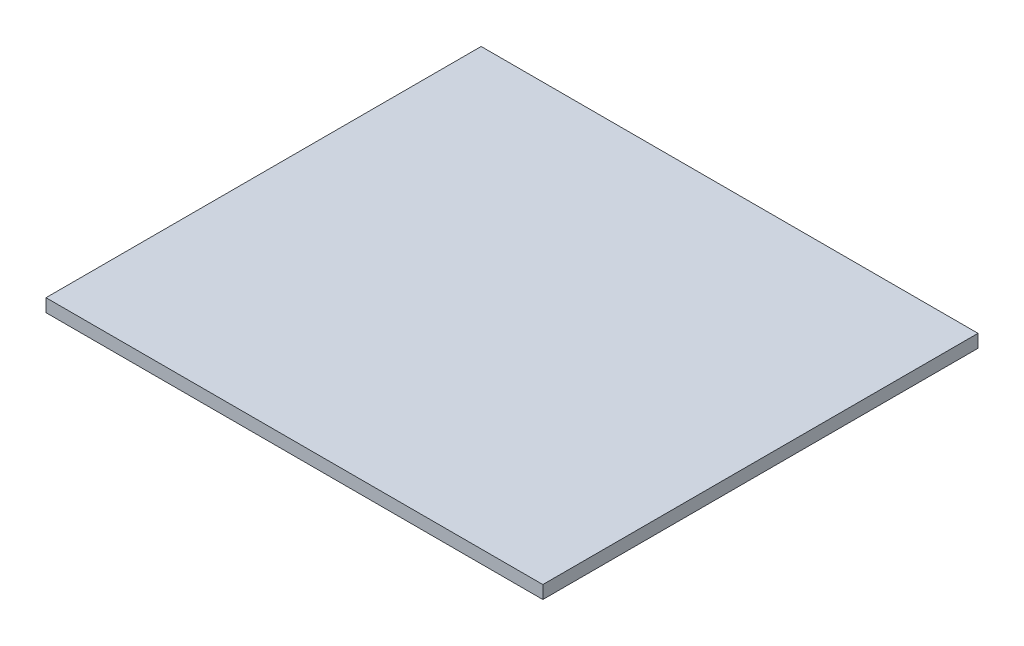
ISO-10303-21;
HEADER;
FILE_DESCRIPTION(('STEP AP214'),'2;1');
FILE_NAME('part.step','',(''),(''),'','','');
FILE_SCHEMA(('AUTOMOTIVE_DESIGN { 1 0 10303 214 1 1 1 1 }'));
ENDSEC;
DATA;
#1=APPLICATION_CONTEXT('core data for automotive mechanical design processes');
#2=APPLICATION_PROTOCOL_DEFINITION('international standard','automotive_design',2000,#1);
#3=PRODUCT_CONTEXT('',#1,'mechanical');
#4=PRODUCT('Part','Part','',(#3));
#5=PRODUCT_RELATED_PRODUCT_CATEGORY('part','',(#4));
#6=PRODUCT_DEFINITION_FORMATION('','',#4);
#7=PRODUCT_DEFINITION_CONTEXT('part definition',#1,'design');
#8=PRODUCT_DEFINITION('design','',#6,#7);
#9=PRODUCT_DEFINITION_SHAPE('','',#8);
#10=(LENGTH_UNIT() NAMED_UNIT(*) SI_UNIT(.MILLI.,.METRE.));
#11=(NAMED_UNIT(*) PLANE_ANGLE_UNIT() SI_UNIT($,.RADIAN.));
#12=(NAMED_UNIT(*) SI_UNIT($,.STERADIAN.) SOLID_ANGLE_UNIT());
#13=UNCERTAINTY_MEASURE_WITH_UNIT(LENGTH_MEASURE(1.E-05),#10,'distance_accuracy_value','');
#14=(GEOMETRIC_REPRESENTATION_CONTEXT(3) GLOBAL_UNCERTAINTY_ASSIGNED_CONTEXT((#13)) GLOBAL_UNIT_ASSIGNED_CONTEXT((#10,
#11,#12)) REPRESENTATION_CONTEXT('',''));
#15=CARTESIAN_POINT('',(0.,0.,0.));
#16=DIRECTION('',(0.,0.,1.));
#17=DIRECTION('',(1.,0.,0.));
#18=AXIS2_PLACEMENT_3D('',#15,#16,#17);
#19=CARTESIAN_POINT('',(0.,2.9972,96.38));
#20=DIRECTION('',(1.,0.,0.));
#21=DIRECTION('',(0.,0.,-1.));
#22=AXIS2_PLACEMENT_3D('',#19,#20,#21);
#23=PLANE('',#22);
#24=DIRECTION('',(0.,0.,1.));
#25=VECTOR('',#24,1.);
#26=CARTESIAN_POINT('',(0.,0.,96.38));
#27=LINE('',#26,#25);
#28=CARTESIAN_POINT('',(0.,0.,-3.95));
#29=VERTEX_POINT('',#28);
#30=CARTESIAN_POINT('',(0.,0.,96.38));
#31=VERTEX_POINT('',#30);
#32=EDGE_CURVE('E113',#29,#31,#27,.T.);
#33=ORIENTED_EDGE('',*,*,#32,.T.);
#34=DIRECTION('',(0.,-1.,0.));
#35=VECTOR('',#34,1.);
#36=CARTESIAN_POINT('',(0.,2.9972,96.38));
#37=LINE('',#36,#35);
#38=CARTESIAN_POINT('',(0.,2.9972,96.38));
#39=VERTEX_POINT('',#38);
#40=EDGE_CURVE('E11',#39,#31,#37,.T.);
#41=ORIENTED_EDGE('',*,*,#40,.F.);
#42=DIRECTION('',(0.,0.,1.));
#43=VECTOR('',#42,1.);
#44=CARTESIAN_POINT('',(0.,2.9972,96.38));
#45=LINE('',#44,#43);
#46=CARTESIAN_POINT('',(0.,2.9972,-3.95));
#47=VERTEX_POINT('',#46);
#48=EDGE_CURVE('E97',#47,#39,#45,.T.);
#49=ORIENTED_EDGE('',*,*,#48,.F.);
#50=DIRECTION('',(0.,-1.,0.));
#51=VECTOR('',#50,1.);
#52=CARTESIAN_POINT('',(0.,2.9972,-3.95));
#53=LINE('',#52,#51);
#54=EDGE_CURVE('E109',#47,#29,#53,.T.);
#55=ORIENTED_EDGE('',*,*,#54,.T.);
#56=EDGE_LOOP('',(#33,#41,#49,#55));
#57=FACE_BOUND('',#56,.T.);
#58=ADVANCED_FACE('F45',(#57),#23,.F.);
#59=CARTESIAN_POINT('',(0.,2.9972,96.38));
#60=DIRECTION('',(0.,0.,-1.));
#61=DIRECTION('',(-1.,0.,0.));
#62=AXIS2_PLACEMENT_3D('',#59,#60,#61);
#63=PLANE('',#62);
#64=DIRECTION('',(1.,0.,0.));
#65=VECTOR('',#64,1.);
#66=CARTESIAN_POINT('',(0.,0.,96.38));
#67=LINE('',#66,#65);
#68=CARTESIAN_POINT('',(114.554,0.,96.38));
#69=VERTEX_POINT('',#68);
#70=EDGE_CURVE('E102',#31,#69,#67,.T.);
#71=ORIENTED_EDGE('',*,*,#70,.T.);
#72=DIRECTION('',(0.,-1.,0.));
#73=VECTOR('',#72,1.);
#74=CARTESIAN_POINT('',(114.554,2.9972,96.38));
#75=LINE('',#74,#73);
#76=CARTESIAN_POINT('',(114.554,2.9972,96.38));
#77=VERTEX_POINT('',#76);
#78=EDGE_CURVE('E54',#77,#69,#75,.T.);
#79=ORIENTED_EDGE('',*,*,#78,.F.);
#80=DIRECTION('',(1.,0.,0.));
#81=VECTOR('',#80,1.);
#82=CARTESIAN_POINT('',(0.,2.9972,96.38));
#83=LINE('',#82,#81);
#84=EDGE_CURVE('E92',#39,#77,#83,.T.);
#85=ORIENTED_EDGE('',*,*,#84,.F.);
#86=ORIENTED_EDGE('',*,*,#40,.T.);
#87=EDGE_LOOP('',(#71,#79,#85,#86));
#88=FACE_BOUND('',#87,.T.);
#89=ADVANCED_FACE('F101',(#88),#63,.F.);
#90=CARTESIAN_POINT('',(114.554,2.9972,96.38));
#91=DIRECTION('',(-1.,0.,0.));
#92=DIRECTION('',(0.,0.,1.));
#93=AXIS2_PLACEMENT_3D('',#90,#91,#92);
#94=PLANE('',#93);
#95=DIRECTION('',(0.,0.,-1.));
#96=VECTOR('',#95,1.);
#97=CARTESIAN_POINT('',(114.554,0.,96.38));
#98=LINE('',#97,#96);
#99=CARTESIAN_POINT('',(114.554,0.,-3.95));
#100=VERTEX_POINT('',#99);
#101=EDGE_CURVE('E79',#69,#100,#98,.T.);
#102=ORIENTED_EDGE('',*,*,#101,.T.);
#103=DIRECTION('',(0.,-1.,0.));
#104=VECTOR('',#103,1.);
#105=CARTESIAN_POINT('',(114.554,2.9972,-3.95));
#106=LINE('',#105,#104);
#107=CARTESIAN_POINT('',(114.554,2.9972,-3.95));
#108=VERTEX_POINT('',#107);
#109=EDGE_CURVE('E104',#108,#100,#106,.T.);
#110=ORIENTED_EDGE('',*,*,#109,.F.);
#111=DIRECTION('',(0.,0.,-1.));
#112=VECTOR('',#111,1.);
#113=CARTESIAN_POINT('',(114.554,2.9972,96.38));
#114=LINE('',#113,#112);
#115=EDGE_CURVE('E95',#77,#108,#114,.T.);
#116=ORIENTED_EDGE('',*,*,#115,.F.);
#117=ORIENTED_EDGE('',*,*,#78,.T.);
#118=EDGE_LOOP('',(#102,#110,#116,#117));
#119=FACE_BOUND('',#118,.T.);
#120=ADVANCED_FACE('F105',(#119),#94,.F.);
#121=CARTESIAN_POINT('',(0.,2.9972,-3.95));
#122=DIRECTION('',(0.,0.,1.));
#123=DIRECTION('',(1.,0.,0.));
#124=AXIS2_PLACEMENT_3D('',#121,#122,#123);
#125=PLANE('',#124);
#126=DIRECTION('',(-1.,0.,0.));
#127=VECTOR('',#126,1.);
#128=CARTESIAN_POINT('',(0.,0.,-3.95));
#129=LINE('',#128,#127);
#130=EDGE_CURVE('E85',#100,#29,#129,.T.);
#131=ORIENTED_EDGE('',*,*,#130,.T.);
#132=ORIENTED_EDGE('',*,*,#54,.F.);
#133=DIRECTION('',(-1.,0.,0.));
#134=VECTOR('',#133,1.);
#135=CARTESIAN_POINT('',(0.,2.9972,-3.95));
#136=LINE('',#135,#134);
#137=EDGE_CURVE('E62',#108,#47,#136,.T.);
#138=ORIENTED_EDGE('',*,*,#137,.F.);
#139=ORIENTED_EDGE('',*,*,#109,.T.);
#140=EDGE_LOOP('',(#131,#132,#138,#139));
#141=FACE_BOUND('',#140,.T.);
#142=ADVANCED_FACE('F126',(#141),#125,.F.);
#143=CARTESIAN_POINT('',(0.,2.9972,0.));
#144=DIRECTION('',(0.,-1.,0.));
#145=DIRECTION('',(0.,0.,-1.));
#146=AXIS2_PLACEMENT_3D('',#143,#144,#145);
#147=PLANE('',#146);
#148=ORIENTED_EDGE('',*,*,#48,.T.);
#149=ORIENTED_EDGE('',*,*,#84,.T.);
#150=ORIENTED_EDGE('',*,*,#115,.T.);
#151=ORIENTED_EDGE('',*,*,#137,.T.);
#152=EDGE_LOOP('',(#148,#149,#150,#151));
#153=FACE_BOUND('',#152,.T.);
#154=ADVANCED_FACE('F93',(#153),#147,.F.);
#155=CARTESIAN_POINT('',(0.,0.,0.));
#156=DIRECTION('',(0.,-1.,0.));
#157=DIRECTION('',(0.,0.,-1.));
#158=AXIS2_PLACEMENT_3D('',#155,#156,#157);
#159=PLANE('',#158);
#160=ORIENTED_EDGE('',*,*,#32,.F.);
#161=ORIENTED_EDGE('',*,*,#130,.F.);
#162=ORIENTED_EDGE('',*,*,#101,.F.);
#163=ORIENTED_EDGE('',*,*,#70,.F.);
#164=EDGE_LOOP('',(#160,#161,#162,#163));
#165=FACE_BOUND('',#164,.T.);
#166=ADVANCED_FACE('F129',(#165),#159,.T.);
#167=CLOSED_SHELL('',(#58,#89,#120,#142,#154,#166));
#168=MANIFOLD_SOLID_BREP('B2',#167);
#169=ADVANCED_BREP_SHAPE_REPRESENTATION('',(#18,#168),#14);
#170=SHAPE_DEFINITION_REPRESENTATION(#9,#169);
ENDSEC;
END-ISO-10303-21;
